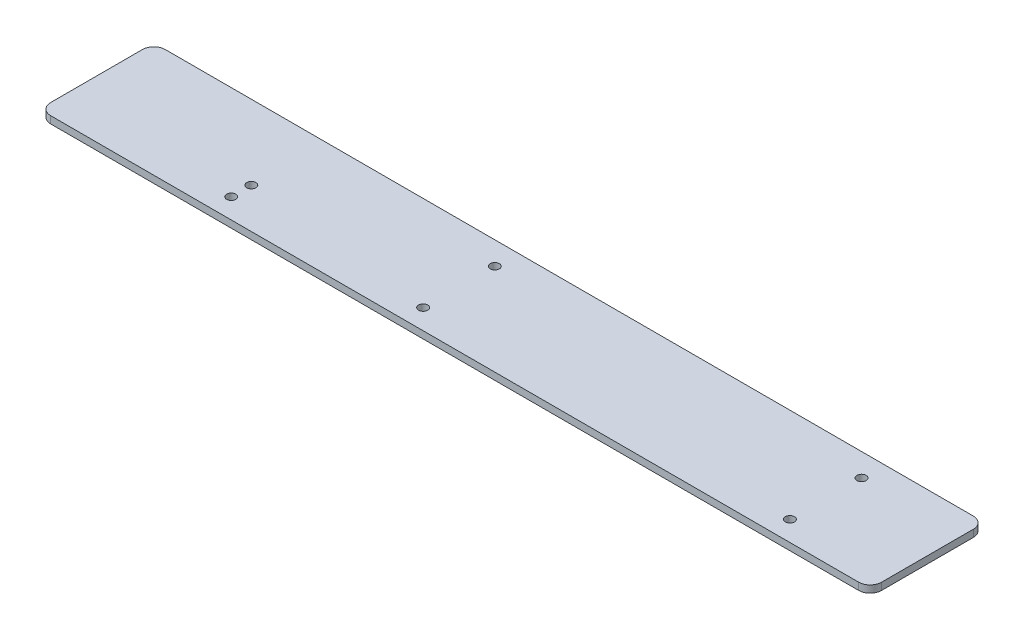
ISO-10303-21;
HEADER;
FILE_DESCRIPTION(('STEP AP214'),'2;1');
FILE_NAME('part.step','',(''),(''),'','','');
FILE_SCHEMA(('AUTOMOTIVE_DESIGN { 1 0 10303 214 1 1 1 1 }'));
ENDSEC;
DATA;
#1=APPLICATION_CONTEXT('core data for automotive mechanical design processes');
#2=APPLICATION_PROTOCOL_DEFINITION('international standard','automotive_design',2000,#1);
#3=PRODUCT_CONTEXT('',#1,'mechanical');
#4=PRODUCT('Part','Part','',(#3));
#5=PRODUCT_RELATED_PRODUCT_CATEGORY('part','',(#4));
#6=PRODUCT_DEFINITION_FORMATION('','',#4);
#7=PRODUCT_DEFINITION_CONTEXT('part definition',#1,'design');
#8=PRODUCT_DEFINITION('design','',#6,#7);
#9=PRODUCT_DEFINITION_SHAPE('','',#8);
#10=(LENGTH_UNIT() NAMED_UNIT(*) SI_UNIT(.MILLI.,.METRE.));
#11=(NAMED_UNIT(*) PLANE_ANGLE_UNIT() SI_UNIT($,.RADIAN.));
#12=(NAMED_UNIT(*) SI_UNIT($,.STERADIAN.) SOLID_ANGLE_UNIT());
#13=UNCERTAINTY_MEASURE_WITH_UNIT(LENGTH_MEASURE(1.E-05),#10,'distance_accuracy_value','');
#14=(GEOMETRIC_REPRESENTATION_CONTEXT(3) GLOBAL_UNCERTAINTY_ASSIGNED_CONTEXT((#13)) GLOBAL_UNIT_ASSIGNED_CONTEXT((#10,
#11,#12)) REPRESENTATION_CONTEXT('',''));
#15=CARTESIAN_POINT('',(0.,0.,0.));
#16=DIRECTION('',(0.,0.,1.));
#17=DIRECTION('',(1.,0.,0.));
#18=AXIS2_PLACEMENT_3D('',#15,#16,#17);
#19=CARTESIAN_POINT('',(0.,3.175,0.));
#20=DIRECTION('',(0.,1.,0.));
#21=DIRECTION('',(0.,0.,1.));
#22=AXIS2_PLACEMENT_3D('',#19,#20,#21);
#23=PLANE('',#22);
#24=CARTESIAN_POINT('',(-107.95,3.175,16.5100000000001));
#25=DIRECTION('',(0.,1.,0.));
#26=DIRECTION('',(0.,0.,1.));
#27=AXIS2_PLACEMENT_3D('',#24,#25,#26);
#28=CIRCLE('',#27,2.03200000000001);
#29=CARTESIAN_POINT('',(-107.95,3.175,18.5420000000001));
#30=VERTEX_POINT('',#29);
#31=EDGE_CURVE('E200',#30,#30,#28,.T.);
#32=ORIENTED_EDGE('',*,*,#31,.F.);
#33=EDGE_LOOP('',(#32));
#34=FACE_BOUND('',#33,.T.);
#35=CARTESIAN_POINT('',(-22.86,3.175,-15.24));
#36=DIRECTION('',(0.,1.,0.));
#37=DIRECTION('',(0.,0.,1.));
#38=AXIS2_PLACEMENT_3D('',#35,#36,#37);
#39=CIRCLE('',#38,2.03200000000001);
#40=CARTESIAN_POINT('',(-22.86,3.175,-13.208));
#41=VERTEX_POINT('',#40);
#42=EDGE_CURVE('E213',#41,#41,#39,.T.);
#43=ORIENTED_EDGE('',*,*,#42,.F.);
#44=EDGE_LOOP('',(#43));
#45=FACE_BOUND('',#44,.T.);
#46=CARTESIAN_POINT('',(139.7,3.175,-15.24));
#47=DIRECTION('',(0.,1.,0.));
#48=DIRECTION('',(0.,0.,1.));
#49=AXIS2_PLACEMENT_3D('',#46,#47,#48);
#50=CIRCLE('',#49,2.03200000000001);
#51=CARTESIAN_POINT('',(139.7,3.175,-13.208));
#52=VERTEX_POINT('',#51);
#53=EDGE_CURVE('E142',#52,#52,#50,.T.);
#54=ORIENTED_EDGE('',*,*,#53,.F.);
#55=EDGE_LOOP('',(#54));
#56=FACE_BOUND('',#55,.T.);
#57=DIRECTION('',(1.,0.,0.));
#58=VECTOR('',#57,1.);
#59=CARTESIAN_POINT('',(-184.15,3.175,25.4));
#60=LINE('',#59,#58);
#61=CARTESIAN_POINT('',(-179.07,3.175,25.4));
#62=VERTEX_POINT('',#61);
#63=CARTESIAN_POINT('',(179.07,3.175,25.4));
#64=VERTEX_POINT('',#63);
#65=EDGE_CURVE('E151',#62,#64,#60,.T.);
#66=ORIENTED_EDGE('',*,*,#65,.T.);
#67=CARTESIAN_POINT('',(179.07,3.175,20.32));
#68=DIRECTION('',(0.,1.,0.));
#69=DIRECTION('',(0.,0.,1.));
#70=AXIS2_PLACEMENT_3D('',#67,#68,#69);
#71=CIRCLE('',#70,5.08);
#72=CARTESIAN_POINT('',(184.15,3.175,20.32));
#73=VERTEX_POINT('',#72);
#74=EDGE_CURVE('E171',#64,#73,#71,.T.);
#75=ORIENTED_EDGE('',*,*,#74,.T.);
#76=DIRECTION('',(0.,0.,-1.));
#77=VECTOR('',#76,1.);
#78=CARTESIAN_POINT('',(184.15,3.175,-25.4));
#79=LINE('',#78,#77);
#80=CARTESIAN_POINT('',(184.15,3.175,-20.32));
#81=VERTEX_POINT('',#80);
#82=EDGE_CURVE('E135',#73,#81,#79,.T.);
#83=ORIENTED_EDGE('',*,*,#82,.T.);
#84=CARTESIAN_POINT('',(179.07,3.175,-20.32));
#85=DIRECTION('',(0.,1.,0.));
#86=DIRECTION('',(0.,0.,1.));
#87=AXIS2_PLACEMENT_3D('',#84,#85,#86);
#88=CIRCLE('',#87,5.08);
#89=CARTESIAN_POINT('',(179.07,3.175,-25.4));
#90=VERTEX_POINT('',#89);
#91=EDGE_CURVE('E172',#81,#90,#88,.T.);
#92=ORIENTED_EDGE('',*,*,#91,.T.);
#93=DIRECTION('',(-1.,0.,0.));
#94=VECTOR('',#93,1.);
#95=CARTESIAN_POINT('',(-184.15,3.175,-25.4));
#96=LINE('',#95,#94);
#97=CARTESIAN_POINT('',(-179.07,3.175,-25.4));
#98=VERTEX_POINT('',#97);
#99=EDGE_CURVE('E184',#90,#98,#96,.T.);
#100=ORIENTED_EDGE('',*,*,#99,.T.);
#101=CARTESIAN_POINT('',(-179.07,3.175,-20.32));
#102=DIRECTION('',(0.,1.,0.));
#103=DIRECTION('',(0.,0.,1.));
#104=AXIS2_PLACEMENT_3D('',#101,#102,#103);
#105=CIRCLE('',#104,5.08);
#106=CARTESIAN_POINT('',(-184.15,3.175,-20.32));
#107=VERTEX_POINT('',#106);
#108=EDGE_CURVE('E68',#98,#107,#105,.T.);
#109=ORIENTED_EDGE('',*,*,#108,.T.);
#110=DIRECTION('',(0.,0.,1.));
#111=VECTOR('',#110,1.);
#112=CARTESIAN_POINT('',(-184.15,3.175,-25.4));
#113=LINE('',#112,#111);
#114=CARTESIAN_POINT('',(-184.15,3.175,20.32));
#115=VERTEX_POINT('',#114);
#116=EDGE_CURVE('E181',#107,#115,#113,.T.);
#117=ORIENTED_EDGE('',*,*,#116,.T.);
#118=CARTESIAN_POINT('',(-179.07,3.175,20.32));
#119=DIRECTION('',(0.,1.,0.));
#120=DIRECTION('',(0.,0.,1.));
#121=AXIS2_PLACEMENT_3D('',#118,#119,#120);
#122=CIRCLE('',#121,5.08);
#123=EDGE_CURVE('E166',#115,#62,#122,.T.);
#124=ORIENTED_EDGE('',*,*,#123,.T.);
#125=EDGE_LOOP('',(#66,#75,#83,#92,#100,#109,#117,#124));
#126=FACE_BOUND('',#125,.T.);
#127=CARTESIAN_POINT('',(139.7,3.175,16.51));
#128=DIRECTION('',(0.,1.,0.));
#129=DIRECTION('',(0.,0.,1.));
#130=AXIS2_PLACEMENT_3D('',#127,#128,#129);
#131=CIRCLE('',#130,2.03200000000001);
#132=CARTESIAN_POINT('',(139.7,3.175,18.542));
#133=VERTEX_POINT('',#132);
#134=EDGE_CURVE('E218',#133,#133,#131,.T.);
#135=ORIENTED_EDGE('',*,*,#134,.F.);
#136=EDGE_LOOP('',(#135));
#137=FACE_BOUND('',#136,.T.);
#138=CARTESIAN_POINT('',(-22.86,3.175,16.51));
#139=DIRECTION('',(0.,1.,0.));
#140=DIRECTION('',(0.,0.,1.));
#141=AXIS2_PLACEMENT_3D('',#138,#139,#140);
#142=CIRCLE('',#141,2.03200000000001);
#143=CARTESIAN_POINT('',(-22.86,3.175,18.542));
#144=VERTEX_POINT('',#143);
#145=EDGE_CURVE('E210',#144,#144,#142,.T.);
#146=ORIENTED_EDGE('',*,*,#145,.F.);
#147=EDGE_LOOP('',(#146));
#148=FACE_BOUND('',#147,.T.);
#149=CARTESIAN_POINT('',(-107.95,3.175,7.62000000000009));
#150=DIRECTION('',(0.,1.,0.));
#151=DIRECTION('',(0.,0.,1.));
#152=AXIS2_PLACEMENT_3D('',#149,#150,#151);
#153=CIRCLE('',#152,2.03200000000001);
#154=CARTESIAN_POINT('',(-107.95,3.175,9.6520000000001));
#155=VERTEX_POINT('',#154);
#156=EDGE_CURVE('E187',#155,#155,#153,.T.);
#157=ORIENTED_EDGE('',*,*,#156,.F.);
#158=EDGE_LOOP('',(#157));
#159=FACE_BOUND('',#158,.T.);
#160=ADVANCED_FACE('F44',(#34,#45,#56,#126,#137,#148,#159),#23,.T.);
#161=CARTESIAN_POINT('',(0.,0.,0.));
#162=DIRECTION('',(0.,1.,0.));
#163=DIRECTION('',(0.,0.,1.));
#164=AXIS2_PLACEMENT_3D('',#161,#162,#163);
#165=PLANE('',#164);
#166=DIRECTION('',(0.,0.,-1.));
#167=VECTOR('',#166,1.);
#168=CARTESIAN_POINT('',(184.15,0.,-25.4));
#169=LINE('',#168,#167);
#170=CARTESIAN_POINT('',(184.15,0.,20.32));
#171=VERTEX_POINT('',#170);
#172=CARTESIAN_POINT('',(184.15,0.,-20.32));
#173=VERTEX_POINT('',#172);
#174=EDGE_CURVE('E133',#171,#173,#169,.T.);
#175=ORIENTED_EDGE('',*,*,#174,.F.);
#176=CARTESIAN_POINT('',(179.07,0.,20.32));
#177=DIRECTION('',(0.,1.,0.));
#178=DIRECTION('',(0.,0.,1.));
#179=AXIS2_PLACEMENT_3D('',#176,#177,#178);
#180=CIRCLE('',#179,5.08);
#181=CARTESIAN_POINT('',(179.07,0.,25.4));
#182=VERTEX_POINT('',#181);
#183=EDGE_CURVE('E111',#171,#182,#180,.F.);
#184=ORIENTED_EDGE('',*,*,#183,.T.);
#185=DIRECTION('',(1.,0.,0.));
#186=VECTOR('',#185,1.);
#187=CARTESIAN_POINT('',(-184.15,0.,25.4));
#188=LINE('',#187,#186);
#189=CARTESIAN_POINT('',(-179.07,0.,25.4));
#190=VERTEX_POINT('',#189);
#191=EDGE_CURVE('E156',#190,#182,#188,.T.);
#192=ORIENTED_EDGE('',*,*,#191,.F.);
#193=CARTESIAN_POINT('',(-179.07,0.,20.32));
#194=DIRECTION('',(0.,1.,0.));
#195=DIRECTION('',(0.,0.,1.));
#196=AXIS2_PLACEMENT_3D('',#193,#194,#195);
#197=CIRCLE('',#196,5.08);
#198=CARTESIAN_POINT('',(-184.15,0.,20.32));
#199=VERTEX_POINT('',#198);
#200=EDGE_CURVE('E131',#190,#199,#197,.F.);
#201=ORIENTED_EDGE('',*,*,#200,.T.);
#202=DIRECTION('',(0.,0.,1.));
#203=VECTOR('',#202,1.);
#204=CARTESIAN_POINT('',(-184.15,0.,-25.4));
#205=LINE('',#204,#203);
#206=CARTESIAN_POINT('',(-184.15,0.,-20.32));
#207=VERTEX_POINT('',#206);
#208=EDGE_CURVE('E144',#207,#199,#205,.T.);
#209=ORIENTED_EDGE('',*,*,#208,.F.);
#210=CARTESIAN_POINT('',(-179.07,0.,-20.32));
#211=DIRECTION('',(0.,1.,0.));
#212=DIRECTION('',(0.,0.,1.));
#213=AXIS2_PLACEMENT_3D('',#210,#211,#212);
#214=CIRCLE('',#213,5.08);
#215=CARTESIAN_POINT('',(-179.07,0.,-25.4));
#216=VERTEX_POINT('',#215);
#217=EDGE_CURVE('E165',#207,#216,#214,.F.);
#218=ORIENTED_EDGE('',*,*,#217,.T.);
#219=DIRECTION('',(-1.,0.,0.));
#220=VECTOR('',#219,1.);
#221=CARTESIAN_POINT('',(-184.15,0.,-25.4));
#222=LINE('',#221,#220);
#223=CARTESIAN_POINT('',(179.07,0.,-25.4));
#224=VERTEX_POINT('',#223);
#225=EDGE_CURVE('E143',#224,#216,#222,.T.);
#226=ORIENTED_EDGE('',*,*,#225,.F.);
#227=CARTESIAN_POINT('',(179.07,0.,-20.32));
#228=DIRECTION('',(0.,1.,0.));
#229=DIRECTION('',(0.,0.,1.));
#230=AXIS2_PLACEMENT_3D('',#227,#228,#229);
#231=CIRCLE('',#230,5.08);
#232=EDGE_CURVE('E121',#224,#173,#231,.F.);
#233=ORIENTED_EDGE('',*,*,#232,.T.);
#234=EDGE_LOOP('',(#175,#184,#192,#201,#209,#218,#226,#233));
#235=FACE_BOUND('',#234,.T.);
#236=CARTESIAN_POINT('',(139.7,0.,-15.24));
#237=DIRECTION('',(0.,1.,0.));
#238=DIRECTION('',(0.,0.,1.));
#239=AXIS2_PLACEMENT_3D('',#236,#237,#238);
#240=CIRCLE('',#239,2.03200000000001);
#241=CARTESIAN_POINT('',(139.7,0.,-13.208));
#242=VERTEX_POINT('',#241);
#243=EDGE_CURVE('E146',#242,#242,#240,.T.);
#244=ORIENTED_EDGE('',*,*,#243,.T.);
#245=EDGE_LOOP('',(#244));
#246=FACE_BOUND('',#245,.T.);
#247=CARTESIAN_POINT('',(139.7,0.,16.51));
#248=DIRECTION('',(0.,1.,0.));
#249=DIRECTION('',(0.,0.,1.));
#250=AXIS2_PLACEMENT_3D('',#247,#248,#249);
#251=CIRCLE('',#250,2.03200000000001);
#252=CARTESIAN_POINT('',(139.7,0.,18.542));
#253=VERTEX_POINT('',#252);
#254=EDGE_CURVE('E216',#253,#253,#251,.T.);
#255=ORIENTED_EDGE('',*,*,#254,.T.);
#256=EDGE_LOOP('',(#255));
#257=FACE_BOUND('',#256,.T.);
#258=CARTESIAN_POINT('',(-22.86,0.,-15.24));
#259=DIRECTION('',(0.,1.,0.));
#260=DIRECTION('',(0.,0.,1.));
#261=AXIS2_PLACEMENT_3D('',#258,#259,#260);
#262=CIRCLE('',#261,2.03200000000001);
#263=CARTESIAN_POINT('',(-22.86,0.,-13.208));
#264=VERTEX_POINT('',#263);
#265=EDGE_CURVE('E211',#264,#264,#262,.T.);
#266=ORIENTED_EDGE('',*,*,#265,.T.);
#267=EDGE_LOOP('',(#266));
#268=FACE_BOUND('',#267,.T.);
#269=CARTESIAN_POINT('',(-22.86,0.,16.51));
#270=DIRECTION('',(0.,1.,0.));
#271=DIRECTION('',(0.,0.,1.));
#272=AXIS2_PLACEMENT_3D('',#269,#270,#271);
#273=CIRCLE('',#272,2.03200000000001);
#274=CARTESIAN_POINT('',(-22.86,0.,18.542));
#275=VERTEX_POINT('',#274);
#276=EDGE_CURVE('E205',#275,#275,#273,.T.);
#277=ORIENTED_EDGE('',*,*,#276,.T.);
#278=EDGE_LOOP('',(#277));
#279=FACE_BOUND('',#278,.T.);
#280=CARTESIAN_POINT('',(-107.95,0.,16.5100000000001));
#281=DIRECTION('',(0.,1.,0.));
#282=DIRECTION('',(0.,0.,1.));
#283=AXIS2_PLACEMENT_3D('',#280,#281,#282);
#284=CIRCLE('',#283,2.03200000000001);
#285=CARTESIAN_POINT('',(-107.95,0.,18.5420000000001));
#286=VERTEX_POINT('',#285);
#287=EDGE_CURVE('E192',#286,#286,#284,.T.);
#288=ORIENTED_EDGE('',*,*,#287,.T.);
#289=EDGE_LOOP('',(#288));
#290=FACE_BOUND('',#289,.T.);
#291=CARTESIAN_POINT('',(-107.95,0.,7.62000000000009));
#292=DIRECTION('',(0.,1.,0.));
#293=DIRECTION('',(0.,0.,1.));
#294=AXIS2_PLACEMENT_3D('',#291,#292,#293);
#295=CIRCLE('',#294,2.03200000000001);
#296=CARTESIAN_POINT('',(-107.95,0.,9.6520000000001));
#297=VERTEX_POINT('',#296);
#298=EDGE_CURVE('E195',#297,#297,#295,.T.);
#299=ORIENTED_EDGE('',*,*,#298,.T.);
#300=EDGE_LOOP('',(#299));
#301=FACE_BOUND('',#300,.T.);
#302=ADVANCED_FACE('F138',(#235,#246,#257,#268,#279,#290,#301),#165,.F.);
#303=CARTESIAN_POINT('',(184.15,3.175,-25.4));
#304=DIRECTION('',(-1.,0.,0.));
#305=DIRECTION('',(0.,0.,1.));
#306=AXIS2_PLACEMENT_3D('',#303,#304,#305);
#307=PLANE('',#306);
#308=ORIENTED_EDGE('',*,*,#82,.F.);
#309=DIRECTION('',(0.,-1.,0.));
#310=VECTOR('',#309,1.);
#311=CARTESIAN_POINT('',(184.15,3.175,20.32));
#312=LINE('',#311,#310);
#313=EDGE_CURVE('E117',#73,#171,#312,.T.);
#314=ORIENTED_EDGE('',*,*,#313,.T.);
#315=ORIENTED_EDGE('',*,*,#174,.T.);
#316=DIRECTION('',(0.,-1.,0.));
#317=VECTOR('',#316,1.);
#318=CARTESIAN_POINT('',(184.15,3.175,-20.32));
#319=LINE('',#318,#317);
#320=EDGE_CURVE('E137',#173,#81,#319,.F.);
#321=ORIENTED_EDGE('',*,*,#320,.T.);
#322=EDGE_LOOP('',(#308,#314,#315,#321));
#323=FACE_BOUND('',#322,.T.);
#324=ADVANCED_FACE('F128',(#323),#307,.F.);
#325=CARTESIAN_POINT('',(-184.15,3.175,-25.4));
#326=DIRECTION('',(0.,0.,1.));
#327=DIRECTION('',(1.,0.,0.));
#328=AXIS2_PLACEMENT_3D('',#325,#326,#327);
#329=PLANE('',#328);
#330=ORIENTED_EDGE('',*,*,#99,.F.);
#331=DIRECTION('',(0.,-1.,0.));
#332=VECTOR('',#331,1.);
#333=CARTESIAN_POINT('',(179.07,3.175,-25.4));
#334=LINE('',#333,#332);
#335=EDGE_CURVE('E179',#90,#224,#334,.T.);
#336=ORIENTED_EDGE('',*,*,#335,.T.);
#337=ORIENTED_EDGE('',*,*,#225,.T.);
#338=DIRECTION('',(0.,-1.,0.));
#339=VECTOR('',#338,1.);
#340=CARTESIAN_POINT('',(-179.07,3.175,-25.4));
#341=LINE('',#340,#339);
#342=EDGE_CURVE('E180',#216,#98,#341,.F.);
#343=ORIENTED_EDGE('',*,*,#342,.T.);
#344=EDGE_LOOP('',(#330,#336,#337,#343));
#345=FACE_BOUND('',#344,.T.);
#346=ADVANCED_FACE('F247',(#345),#329,.F.);
#347=CARTESIAN_POINT('',(-184.15,3.175,-25.4));
#348=DIRECTION('',(1.,0.,0.));
#349=DIRECTION('',(0.,0.,-1.));
#350=AXIS2_PLACEMENT_3D('',#347,#348,#349);
#351=PLANE('',#350);
#352=ORIENTED_EDGE('',*,*,#116,.F.);
#353=DIRECTION('',(0.,-1.,0.));
#354=VECTOR('',#353,1.);
#355=CARTESIAN_POINT('',(-184.15,3.175,-20.32));
#356=LINE('',#355,#354);
#357=EDGE_CURVE('E11',#107,#207,#356,.T.);
#358=ORIENTED_EDGE('',*,*,#357,.T.);
#359=ORIENTED_EDGE('',*,*,#208,.T.);
#360=DIRECTION('',(0.,-1.,0.));
#361=VECTOR('',#360,1.);
#362=CARTESIAN_POINT('',(-184.15,3.175,20.32));
#363=LINE('',#362,#361);
#364=EDGE_CURVE('E52',#199,#115,#363,.F.);
#365=ORIENTED_EDGE('',*,*,#364,.T.);
#366=EDGE_LOOP('',(#352,#358,#359,#365));
#367=FACE_BOUND('',#366,.T.);
#368=ADVANCED_FACE('F240',(#367),#351,.F.);
#369=CARTESIAN_POINT('',(-184.15,3.175,25.4));
#370=DIRECTION('',(0.,0.,-1.));
#371=DIRECTION('',(-1.,0.,0.));
#372=AXIS2_PLACEMENT_3D('',#369,#370,#371);
#373=PLANE('',#372);
#374=ORIENTED_EDGE('',*,*,#191,.T.);
#375=DIRECTION('',(0.,-1.,0.));
#376=VECTOR('',#375,1.);
#377=CARTESIAN_POINT('',(179.07,3.175,25.4));
#378=LINE('',#377,#376);
#379=EDGE_CURVE('E120',#182,#64,#378,.F.);
#380=ORIENTED_EDGE('',*,*,#379,.T.);
#381=ORIENTED_EDGE('',*,*,#65,.F.);
#382=DIRECTION('',(0.,-1.,0.));
#383=VECTOR('',#382,1.);
#384=CARTESIAN_POINT('',(-179.07,3.175,25.4));
#385=LINE('',#384,#383);
#386=EDGE_CURVE('E124',#62,#190,#385,.T.);
#387=ORIENTED_EDGE('',*,*,#386,.T.);
#388=EDGE_LOOP('',(#374,#380,#381,#387));
#389=FACE_BOUND('',#388,.T.);
#390=ADVANCED_FACE('F242',(#389),#373,.F.);
#391=CARTESIAN_POINT('',(139.7,3.175,-15.24));
#392=DIRECTION('',(0.,-1.,0.));
#393=DIRECTION('',(0.,0.,-1.));
#394=AXIS2_PLACEMENT_3D('',#391,#392,#393);
#395=CYLINDRICAL_SURFACE('',#394,2.03200000000001);
#396=ORIENTED_EDGE('',*,*,#53,.T.);
#397=EDGE_LOOP('',(#396));
#398=FACE_BOUND('',#397,.T.);
#399=ORIENTED_EDGE('',*,*,#243,.F.);
#400=EDGE_LOOP('',(#399));
#401=FACE_BOUND('',#400,.T.);
#402=ADVANCED_FACE('F263',(#398,#401),#395,.F.);
#403=CARTESIAN_POINT('',(139.7,3.175,16.51));
#404=DIRECTION('',(0.,-1.,0.));
#405=DIRECTION('',(0.,0.,-1.));
#406=AXIS2_PLACEMENT_3D('',#403,#404,#405);
#407=CYLINDRICAL_SURFACE('',#406,2.03200000000001);
#408=ORIENTED_EDGE('',*,*,#134,.T.);
#409=EDGE_LOOP('',(#408));
#410=FACE_BOUND('',#409,.T.);
#411=ORIENTED_EDGE('',*,*,#254,.F.);
#412=EDGE_LOOP('',(#411));
#413=FACE_BOUND('',#412,.T.);
#414=ADVANCED_FACE('F271',(#410,#413),#407,.F.);
#415=CARTESIAN_POINT('',(-22.86,3.175,-15.24));
#416=DIRECTION('',(0.,-1.,0.));
#417=DIRECTION('',(0.,0.,-1.));
#418=AXIS2_PLACEMENT_3D('',#415,#416,#417);
#419=CYLINDRICAL_SURFACE('',#418,2.03200000000001);
#420=ORIENTED_EDGE('',*,*,#42,.T.);
#421=EDGE_LOOP('',(#420));
#422=FACE_BOUND('',#421,.T.);
#423=ORIENTED_EDGE('',*,*,#265,.F.);
#424=EDGE_LOOP('',(#423));
#425=FACE_BOUND('',#424,.T.);
#426=ADVANCED_FACE('F277',(#422,#425),#419,.F.);
#427=CARTESIAN_POINT('',(-22.86,3.175,16.51));
#428=DIRECTION('',(0.,-1.,0.));
#429=DIRECTION('',(0.,0.,-1.));
#430=AXIS2_PLACEMENT_3D('',#427,#428,#429);
#431=CYLINDRICAL_SURFACE('',#430,2.03200000000001);
#432=ORIENTED_EDGE('',*,*,#145,.T.);
#433=EDGE_LOOP('',(#432));
#434=FACE_BOUND('',#433,.T.);
#435=ORIENTED_EDGE('',*,*,#276,.F.);
#436=EDGE_LOOP('',(#435));
#437=FACE_BOUND('',#436,.T.);
#438=ADVANCED_FACE('F296',(#434,#437),#431,.F.);
#439=CARTESIAN_POINT('',(-107.95,3.175,16.5100000000001));
#440=DIRECTION('',(0.,-1.,0.));
#441=DIRECTION('',(0.,0.,-1.));
#442=AXIS2_PLACEMENT_3D('',#439,#440,#441);
#443=CYLINDRICAL_SURFACE('',#442,2.03200000000001);
#444=ORIENTED_EDGE('',*,*,#31,.T.);
#445=EDGE_LOOP('',(#444));
#446=FACE_BOUND('',#445,.T.);
#447=ORIENTED_EDGE('',*,*,#287,.F.);
#448=EDGE_LOOP('',(#447));
#449=FACE_BOUND('',#448,.T.);
#450=ADVANCED_FACE('F294',(#446,#449),#443,.F.);
#451=CARTESIAN_POINT('',(-107.95,3.175,7.62000000000009));
#452=DIRECTION('',(0.,-1.,0.));
#453=DIRECTION('',(0.,0.,-1.));
#454=AXIS2_PLACEMENT_3D('',#451,#452,#453);
#455=CYLINDRICAL_SURFACE('',#454,2.03200000000001);
#456=ORIENTED_EDGE('',*,*,#156,.T.);
#457=EDGE_LOOP('',(#456));
#458=FACE_BOUND('',#457,.T.);
#459=ORIENTED_EDGE('',*,*,#298,.F.);
#460=EDGE_LOOP('',(#459));
#461=FACE_BOUND('',#460,.T.);
#462=ADVANCED_FACE('F295',(#458,#461),#455,.F.);
#463=CARTESIAN_POINT('',(179.07,3.175,20.32));
#464=DIRECTION('',(0.,-1.,0.));
#465=DIRECTION('',(0.,0.,-1.));
#466=AXIS2_PLACEMENT_3D('',#463,#464,#465);
#467=CYLINDRICAL_SURFACE('',#466,5.08);
#468=ORIENTED_EDGE('',*,*,#74,.F.);
#469=ORIENTED_EDGE('',*,*,#379,.F.);
#470=ORIENTED_EDGE('',*,*,#183,.F.);
#471=ORIENTED_EDGE('',*,*,#313,.F.);
#472=EDGE_LOOP('',(#468,#469,#470,#471));
#473=FACE_BOUND('',#472,.T.);
#474=ADVANCED_FACE('F119',(#473),#467,.T.);
#475=CARTESIAN_POINT('',(179.07,3.175,-20.32));
#476=DIRECTION('',(0.,-1.,0.));
#477=DIRECTION('',(0.,0.,-1.));
#478=AXIS2_PLACEMENT_3D('',#475,#476,#477);
#479=CYLINDRICAL_SURFACE('',#478,5.08);
#480=ORIENTED_EDGE('',*,*,#91,.F.);
#481=ORIENTED_EDGE('',*,*,#320,.F.);
#482=ORIENTED_EDGE('',*,*,#232,.F.);
#483=ORIENTED_EDGE('',*,*,#335,.F.);
#484=EDGE_LOOP('',(#480,#481,#482,#483));
#485=FACE_BOUND('',#484,.T.);
#486=ADVANCED_FACE('F241',(#485),#479,.T.);
#487=CARTESIAN_POINT('',(-179.07,3.175,-20.32));
#488=DIRECTION('',(0.,-1.,0.));
#489=DIRECTION('',(0.,0.,-1.));
#490=AXIS2_PLACEMENT_3D('',#487,#488,#489);
#491=CYLINDRICAL_SURFACE('',#490,5.08);
#492=ORIENTED_EDGE('',*,*,#108,.F.);
#493=ORIENTED_EDGE('',*,*,#342,.F.);
#494=ORIENTED_EDGE('',*,*,#217,.F.);
#495=ORIENTED_EDGE('',*,*,#357,.F.);
#496=EDGE_LOOP('',(#492,#493,#494,#495));
#497=FACE_BOUND('',#496,.T.);
#498=ADVANCED_FACE('F231',(#497),#491,.T.);
#499=CARTESIAN_POINT('',(-179.07,3.175,20.32));
#500=DIRECTION('',(0.,-1.,0.));
#501=DIRECTION('',(0.,0.,-1.));
#502=AXIS2_PLACEMENT_3D('',#499,#500,#501);
#503=CYLINDRICAL_SURFACE('',#502,5.08);
#504=ORIENTED_EDGE('',*,*,#123,.F.);
#505=ORIENTED_EDGE('',*,*,#364,.F.);
#506=ORIENTED_EDGE('',*,*,#200,.F.);
#507=ORIENTED_EDGE('',*,*,#386,.F.);
#508=EDGE_LOOP('',(#504,#505,#506,#507));
#509=FACE_BOUND('',#508,.T.);
#510=ADVANCED_FACE('F50',(#509),#503,.T.);
#511=CLOSED_SHELL('',(#160,#302,#324,#346,#368,#390,#402,#414,#426,#438,#450,#462,#474,#486,
#498,#510));
#512=MANIFOLD_SOLID_BREP('B2',#511);
#513=ADVANCED_BREP_SHAPE_REPRESENTATION('',(#18,#512),#14);
#514=SHAPE_DEFINITION_REPRESENTATION(#9,#513);
ENDSEC;
END-ISO-10303-21;
